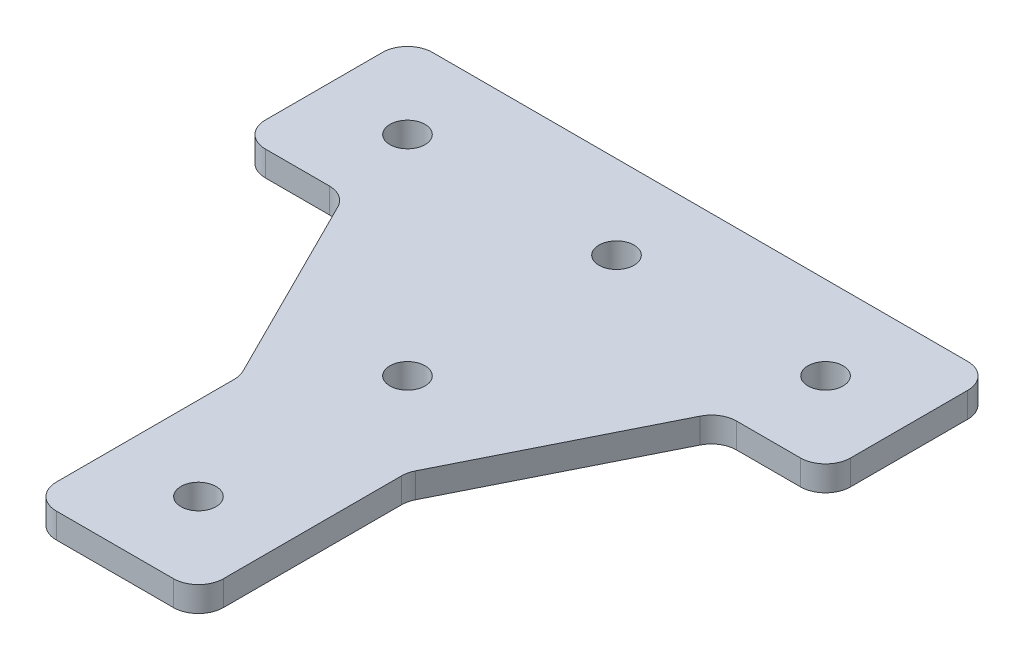
ISO-10303-21;
HEADER;
FILE_DESCRIPTION(('STEP AP214'),'2;1');
FILE_NAME('part.step','',(''),(''),'','','');
FILE_SCHEMA(('AUTOMOTIVE_DESIGN { 1 0 10303 214 1 1 1 1 }'));
ENDSEC;
DATA;
#1=APPLICATION_CONTEXT('core data for automotive mechanical design processes');
#2=APPLICATION_PROTOCOL_DEFINITION('international standard','automotive_design',2000,#1);
#3=PRODUCT_CONTEXT('',#1,'mechanical');
#4=PRODUCT('Part','Part','',(#3));
#5=PRODUCT_RELATED_PRODUCT_CATEGORY('part','',(#4));
#6=PRODUCT_DEFINITION_FORMATION('','',#4);
#7=PRODUCT_DEFINITION_CONTEXT('part definition',#1,'design');
#8=PRODUCT_DEFINITION('design','',#6,#7);
#9=PRODUCT_DEFINITION_SHAPE('','',#8);
#10=(LENGTH_UNIT() NAMED_UNIT(*) SI_UNIT(.MILLI.,.METRE.));
#11=(NAMED_UNIT(*) PLANE_ANGLE_UNIT() SI_UNIT($,.RADIAN.));
#12=(NAMED_UNIT(*) SI_UNIT($,.STERADIAN.) SOLID_ANGLE_UNIT());
#13=UNCERTAINTY_MEASURE_WITH_UNIT(LENGTH_MEASURE(1.E-05),#10,'distance_accuracy_value','');
#14=(GEOMETRIC_REPRESENTATION_CONTEXT(3) GLOBAL_UNCERTAINTY_ASSIGNED_CONTEXT((#13)) GLOBAL_UNIT_ASSIGNED_CONTEXT((#10,
#11,#12)) REPRESENTATION_CONTEXT('',''));
#15=CARTESIAN_POINT('',(0.,0.,0.));
#16=DIRECTION('',(0.,0.,1.));
#17=DIRECTION('',(1.,0.,0.));
#18=AXIS2_PLACEMENT_3D('',#15,#16,#17);
#19=CARTESIAN_POINT('',(22.,3.,11.));
#20=DIRECTION('',(0.894427190999916,0.,0.447213595499958));
#21=DIRECTION('',(0.447213595499958,0.,-0.894427190999916));
#22=AXIS2_PLACEMENT_3D('',#19,#20,#21);
#23=PLANE('',#22);
#24=DIRECTION('',(-0.447213595499958,0.,0.894427190999916));
#25=VECTOR('',#24,1.);
#26=CARTESIAN_POINT('',(22.,3.,11.));
#27=LINE('',#26,#25);
#28=CARTESIAN_POINT('',(21.6708203932499,3.,11.6583592135001));
#29=VERTEX_POINT('',#28);
#30=CARTESIAN_POINT('',(10.3167184270003,3.,34.3665631459995));
#31=VERTEX_POINT('',#30);
#32=EDGE_CURVE('E343',#29,#31,#27,.T.);
#33=ORIENTED_EDGE('',*,*,#32,.T.);
#34=DIRECTION('',(0.,-1.,0.));
#35=VECTOR('',#34,1.);
#36=CARTESIAN_POINT('',(10.3167184270003,3.,34.3665631459995));
#37=LINE('',#36,#35);
#38=CARTESIAN_POINT('',(10.3167184270003,0.,34.3665631459995));
#39=VERTEX_POINT('',#38);
#40=EDGE_CURVE('E197',#31,#39,#37,.T.);
#41=ORIENTED_EDGE('',*,*,#40,.T.);
#42=DIRECTION('',(-0.447213595499958,0.,0.894427190999916));
#43=VECTOR('',#42,1.);
#44=CARTESIAN_POINT('',(22.,0.,11.));
#45=LINE('',#44,#43);
#46=CARTESIAN_POINT('',(21.6708203932499,0.,11.6583592135001));
#47=VERTEX_POINT('',#46);
#48=EDGE_CURVE('E183',#47,#39,#45,.T.);
#49=ORIENTED_EDGE('',*,*,#48,.F.);
#50=DIRECTION('',(0.,-1.,0.));
#51=VECTOR('',#50,1.);
#52=CARTESIAN_POINT('',(21.6708203932499,3.,11.6583592135001));
#53=LINE('',#52,#51);
#54=EDGE_CURVE('E194',#47,#29,#53,.F.);
#55=ORIENTED_EDGE('',*,*,#54,.T.);
#56=EDGE_LOOP('',(#33,#41,#49,#55));
#57=FACE_BOUND('',#56,.T.);
#58=ADVANCED_FACE('F41',(#57),#23,.T.);
#59=CARTESIAN_POINT('',(0.,3.,10.));
#60=DIRECTION('',(0.,0.,-1.));
#61=DIRECTION('',(-1.,0.,0.));
#62=AXIS2_PLACEMENT_3D('',#59,#60,#61);
#63=PLANE('',#62);
#64=DIRECTION('',(1.,0.,0.));
#65=VECTOR('',#64,1.);
#66=CARTESIAN_POINT('',(0.,0.,10.));
#67=LINE('',#66,#65);
#68=CARTESIAN_POINT('',(24.3541019662497,0.,10.));
#69=VERTEX_POINT('',#68);
#70=CARTESIAN_POINT('',(32.,0.,10.));
#71=VERTEX_POINT('',#70);
#72=EDGE_CURVE('E185',#69,#71,#67,.T.);
#73=ORIENTED_EDGE('',*,*,#72,.T.);
#74=DIRECTION('',(0.,-1.,0.));
#75=VECTOR('',#74,1.);
#76=CARTESIAN_POINT('',(32.,3.,10.));
#77=LINE('',#76,#75);
#78=CARTESIAN_POINT('',(32.,3.,10.));
#79=VERTEX_POINT('',#78);
#80=EDGE_CURVE('E276',#71,#79,#77,.F.);
#81=ORIENTED_EDGE('',*,*,#80,.T.);
#82=DIRECTION('',(1.,0.,0.));
#83=VECTOR('',#82,1.);
#84=CARTESIAN_POINT('',(0.,3.,10.));
#85=LINE('',#84,#83);
#86=CARTESIAN_POINT('',(24.3541019662497,3.,10.));
#87=VERTEX_POINT('',#86);
#88=EDGE_CURVE('E346',#87,#79,#85,.T.);
#89=ORIENTED_EDGE('',*,*,#88,.F.);
#90=DIRECTION('',(0.,-1.,0.));
#91=VECTOR('',#90,1.);
#92=CARTESIAN_POINT('',(24.3541019662497,3.,10.));
#93=LINE('',#92,#91);
#94=EDGE_CURVE('E274',#87,#69,#93,.T.);
#95=ORIENTED_EDGE('',*,*,#94,.T.);
#96=EDGE_LOOP('',(#73,#81,#89,#95));
#97=FACE_BOUND('',#96,.T.);
#98=ADVANCED_FACE('F412',(#97),#63,.F.);
#99=CARTESIAN_POINT('',(35.,3.,0.));
#100=DIRECTION('',(-1.,0.,0.));
#101=DIRECTION('',(0.,0.,1.));
#102=AXIS2_PLACEMENT_3D('',#99,#100,#101);
#103=PLANE('',#102);
#104=DIRECTION('',(0.,0.,-1.));
#105=VECTOR('',#104,1.);
#106=CARTESIAN_POINT('',(35.,0.,0.));
#107=LINE('',#106,#105);
#108=CARTESIAN_POINT('',(35.,0.,7.));
#109=VERTEX_POINT('',#108);
#110=CARTESIAN_POINT('',(35.,0.,-7.));
#111=VERTEX_POINT('',#110);
#112=EDGE_CURVE('E379',#109,#111,#107,.T.);
#113=ORIENTED_EDGE('',*,*,#112,.T.);
#114=DIRECTION('',(0.,-1.,0.));
#115=VECTOR('',#114,1.);
#116=CARTESIAN_POINT('',(35.,3.,-7.));
#117=LINE('',#116,#115);
#118=CARTESIAN_POINT('',(35.,3.,-7.));
#119=VERTEX_POINT('',#118);
#120=EDGE_CURVE('E272',#111,#119,#117,.F.);
#121=ORIENTED_EDGE('',*,*,#120,.T.);
#122=DIRECTION('',(0.,0.,-1.));
#123=VECTOR('',#122,1.);
#124=CARTESIAN_POINT('',(35.,3.,0.));
#125=LINE('',#124,#123);
#126=CARTESIAN_POINT('',(35.,3.,7.));
#127=VERTEX_POINT('',#126);
#128=EDGE_CURVE('E349',#127,#119,#125,.T.);
#129=ORIENTED_EDGE('',*,*,#128,.F.);
#130=DIRECTION('',(0.,-1.,0.));
#131=VECTOR('',#130,1.);
#132=CARTESIAN_POINT('',(35.,3.,7.));
#133=LINE('',#132,#131);
#134=EDGE_CURVE('E269',#127,#109,#133,.T.);
#135=ORIENTED_EDGE('',*,*,#134,.T.);
#136=EDGE_LOOP('',(#113,#121,#129,#135));
#137=FACE_BOUND('',#136,.T.);
#138=ADVANCED_FACE('F418',(#137),#103,.F.);
#139=CARTESIAN_POINT('',(0.,3.,-10.));
#140=DIRECTION('',(0.,0.,1.));
#141=DIRECTION('',(1.,0.,0.));
#142=AXIS2_PLACEMENT_3D('',#139,#140,#141);
#143=PLANE('',#142);
#144=DIRECTION('',(-1.,0.,0.));
#145=VECTOR('',#144,1.);
#146=CARTESIAN_POINT('',(0.,3.,-10.));
#147=LINE('',#146,#145);
#148=CARTESIAN_POINT('',(32.,3.,-10.));
#149=VERTEX_POINT('',#148);
#150=CARTESIAN_POINT('',(-32.,3.,-10.));
#151=VERTEX_POINT('',#150);
#152=EDGE_CURVE('E354',#149,#151,#147,.T.);
#153=ORIENTED_EDGE('',*,*,#152,.F.);
#154=DIRECTION('',(0.,-1.,0.));
#155=VECTOR('',#154,1.);
#156=CARTESIAN_POINT('',(32.,3.,-10.));
#157=LINE('',#156,#155);
#158=CARTESIAN_POINT('',(32.,0.,-10.));
#159=VERTEX_POINT('',#158);
#160=EDGE_CURVE('E266',#149,#159,#157,.T.);
#161=ORIENTED_EDGE('',*,*,#160,.T.);
#162=DIRECTION('',(-1.,0.,0.));
#163=VECTOR('',#162,1.);
#164=CARTESIAN_POINT('',(0.,0.,-10.));
#165=LINE('',#164,#163);
#166=CARTESIAN_POINT('',(-32.,0.,-10.));
#167=VERTEX_POINT('',#166);
#168=EDGE_CURVE('E319',#159,#167,#165,.T.);
#169=ORIENTED_EDGE('',*,*,#168,.T.);
#170=DIRECTION('',(0.,-1.,0.));
#171=VECTOR('',#170,1.);
#172=CARTESIAN_POINT('',(-32.,3.,-10.));
#173=LINE('',#172,#171);
#174=EDGE_CURVE('E264',#167,#151,#173,.F.);
#175=ORIENTED_EDGE('',*,*,#174,.T.);
#176=EDGE_LOOP('',(#153,#161,#169,#175));
#177=FACE_BOUND('',#176,.T.);
#178=ADVANCED_FACE('F386',(#177),#143,.F.);
#179=CARTESIAN_POINT('',(-35.,3.,0.));
#180=DIRECTION('',(1.,0.,0.));
#181=DIRECTION('',(0.,0.,-1.));
#182=AXIS2_PLACEMENT_3D('',#179,#180,#181);
#183=PLANE('',#182);
#184=DIRECTION('',(0.,0.,1.));
#185=VECTOR('',#184,1.);
#186=CARTESIAN_POINT('',(-35.,0.,0.));
#187=LINE('',#186,#185);
#188=CARTESIAN_POINT('',(-35.,0.,-7.));
#189=VERTEX_POINT('',#188);
#190=CARTESIAN_POINT('',(-35.,0.,7.));
#191=VERTEX_POINT('',#190);
#192=EDGE_CURVE('E314',#189,#191,#187,.T.);
#193=ORIENTED_EDGE('',*,*,#192,.T.);
#194=DIRECTION('',(0.,-1.,0.));
#195=VECTOR('',#194,1.);
#196=CARTESIAN_POINT('',(-35.,3.,7.));
#197=LINE('',#196,#195);
#198=CARTESIAN_POINT('',(-35.,3.,7.));
#199=VERTEX_POINT('',#198);
#200=EDGE_CURVE('E262',#191,#199,#197,.F.);
#201=ORIENTED_EDGE('',*,*,#200,.T.);
#202=DIRECTION('',(0.,0.,1.));
#203=VECTOR('',#202,1.);
#204=CARTESIAN_POINT('',(-35.,3.,0.));
#205=LINE('',#204,#203);
#206=CARTESIAN_POINT('',(-35.,3.,-7.));
#207=VERTEX_POINT('',#206);
#208=EDGE_CURVE('E357',#207,#199,#205,.T.);
#209=ORIENTED_EDGE('',*,*,#208,.F.);
#210=DIRECTION('',(0.,-1.,0.));
#211=VECTOR('',#210,1.);
#212=CARTESIAN_POINT('',(-35.,3.,-7.));
#213=LINE('',#212,#211);
#214=EDGE_CURVE('E259',#207,#189,#213,.T.);
#215=ORIENTED_EDGE('',*,*,#214,.T.);
#216=EDGE_LOOP('',(#193,#201,#209,#215));
#217=FACE_BOUND('',#216,.T.);
#218=ADVANCED_FACE('F394',(#217),#183,.F.);
#219=CARTESIAN_POINT('',(0.,3.,10.));
#220=DIRECTION('',(0.,0.,-1.));
#221=DIRECTION('',(-1.,0.,0.));
#222=AXIS2_PLACEMENT_3D('',#219,#220,#221);
#223=PLANE('',#222);
#224=DIRECTION('',(1.,0.,0.));
#225=VECTOR('',#224,1.);
#226=CARTESIAN_POINT('',(0.,0.,10.));
#227=LINE('',#226,#225);
#228=CARTESIAN_POINT('',(-32.,0.,10.));
#229=VERTEX_POINT('',#228);
#230=CARTESIAN_POINT('',(-24.3541019662497,0.,10.));
#231=VERTEX_POINT('',#230);
#232=EDGE_CURVE('E309',#229,#231,#227,.T.);
#233=ORIENTED_EDGE('',*,*,#232,.T.);
#234=DIRECTION('',(0.,-1.,0.));
#235=VECTOR('',#234,1.);
#236=CARTESIAN_POINT('',(-24.3541019662497,3.,10.));
#237=LINE('',#236,#235);
#238=CARTESIAN_POINT('',(-24.3541019662497,3.,10.));
#239=VERTEX_POINT('',#238);
#240=EDGE_CURVE('E257',#231,#239,#237,.F.);
#241=ORIENTED_EDGE('',*,*,#240,.T.);
#242=DIRECTION('',(1.,0.,0.));
#243=VECTOR('',#242,1.);
#244=CARTESIAN_POINT('',(0.,3.,10.));
#245=LINE('',#244,#243);
#246=CARTESIAN_POINT('',(-32.,3.,10.));
#247=VERTEX_POINT('',#246);
#248=EDGE_CURVE('E295',#247,#239,#245,.T.);
#249=ORIENTED_EDGE('',*,*,#248,.F.);
#250=DIRECTION('',(0.,-1.,0.));
#251=VECTOR('',#250,1.);
#252=CARTESIAN_POINT('',(-32.,3.,10.));
#253=LINE('',#252,#251);
#254=EDGE_CURVE('E254',#247,#229,#253,.T.);
#255=ORIENTED_EDGE('',*,*,#254,.T.);
#256=EDGE_LOOP('',(#233,#241,#249,#255));
#257=FACE_BOUND('',#256,.T.);
#258=ADVANCED_FACE('F312',(#257),#223,.F.);
#259=CARTESIAN_POINT('',(-22.,3.,11.));
#260=DIRECTION('',(0.894427190999916,0.,-0.447213595499958));
#261=DIRECTION('',(-0.447213595499958,0.,-0.894427190999916));
#262=AXIS2_PLACEMENT_3D('',#259,#260,#261);
#263=PLANE('',#262);
#264=DIRECTION('',(0.447213595499958,0.,0.894427190999916));
#265=VECTOR('',#264,1.);
#266=CARTESIAN_POINT('',(-22.,0.,11.));
#267=LINE('',#266,#265);
#268=CARTESIAN_POINT('',(-21.6708203932499,0.,11.6583592135001));
#269=VERTEX_POINT('',#268);
#270=CARTESIAN_POINT('',(-10.3167184270003,0.,34.3665631459995));
#271=VERTEX_POINT('',#270);
#272=EDGE_CURVE('E310',#269,#271,#267,.T.);
#273=ORIENTED_EDGE('',*,*,#272,.T.);
#274=DIRECTION('',(0.,-1.,0.));
#275=VECTOR('',#274,1.);
#276=CARTESIAN_POINT('',(-10.3167184270003,3.,34.3665631459995));
#277=LINE('',#276,#275);
#278=CARTESIAN_POINT('',(-10.3167184270003,3.,34.3665631459995));
#279=VERTEX_POINT('',#278);
#280=EDGE_CURVE('E252',#271,#279,#277,.F.);
#281=ORIENTED_EDGE('',*,*,#280,.T.);
#282=DIRECTION('',(0.447213595499958,0.,0.894427190999916));
#283=VECTOR('',#282,1.);
#284=CARTESIAN_POINT('',(-22.,3.,11.));
#285=LINE('',#284,#283);
#286=CARTESIAN_POINT('',(-21.6708203932499,3.,11.6583592135001));
#287=VERTEX_POINT('',#286);
#288=EDGE_CURVE('E293',#287,#279,#285,.T.);
#289=ORIENTED_EDGE('',*,*,#288,.F.);
#290=DIRECTION('',(0.,-1.,0.));
#291=VECTOR('',#290,1.);
#292=CARTESIAN_POINT('',(-21.6708203932499,0.,11.6583592135001));
#293=LINE('',#292,#291);
#294=EDGE_CURVE('E249',#287,#269,#293,.T.);
#295=ORIENTED_EDGE('',*,*,#294,.T.);
#296=EDGE_LOOP('',(#273,#281,#289,#295));
#297=FACE_BOUND('',#296,.T.);
#298=ADVANCED_FACE('F301',(#297),#263,.F.);
#299=CARTESIAN_POINT('',(-10.,3.,0.));
#300=DIRECTION('',(1.,0.,0.));
#301=DIRECTION('',(0.,0.,-1.));
#302=AXIS2_PLACEMENT_3D('',#299,#300,#301);
#303=PLANE('',#302);
#304=DIRECTION('',(0.,0.,1.));
#305=VECTOR('',#304,1.);
#306=CARTESIAN_POINT('',(-10.,0.,0.));
#307=LINE('',#306,#305);
#308=CARTESIAN_POINT('',(-10.,0.,35.7082039324994));
#309=VERTEX_POINT('',#308);
#310=CARTESIAN_POINT('',(-9.99999999999999,0.,57.));
#311=VERTEX_POINT('',#310);
#312=EDGE_CURVE('E316',#309,#311,#307,.T.);
#313=ORIENTED_EDGE('',*,*,#312,.T.);
#314=DIRECTION('',(0.,-1.,0.));
#315=VECTOR('',#314,1.);
#316=CARTESIAN_POINT('',(-9.99999999999999,3.,57.));
#317=LINE('',#316,#315);
#318=CARTESIAN_POINT('',(-9.99999999999999,3.,57.));
#319=VERTEX_POINT('',#318);
#320=EDGE_CURVE('E56',#311,#319,#317,.F.);
#321=ORIENTED_EDGE('',*,*,#320,.T.);
#322=DIRECTION('',(0.,0.,1.));
#323=VECTOR('',#322,1.);
#324=CARTESIAN_POINT('',(-10.,3.,0.));
#325=LINE('',#324,#323);
#326=CARTESIAN_POINT('',(-10.,3.,35.7082039324994));
#327=VERTEX_POINT('',#326);
#328=EDGE_CURVE('E304',#327,#319,#325,.T.);
#329=ORIENTED_EDGE('',*,*,#328,.F.);
#330=DIRECTION('',(0.,-1.,0.));
#331=VECTOR('',#330,1.);
#332=CARTESIAN_POINT('',(-10.,0.,35.7082039324994));
#333=LINE('',#332,#331);
#334=EDGE_CURVE('E245',#327,#309,#333,.T.);
#335=ORIENTED_EDGE('',*,*,#334,.T.);
#336=EDGE_LOOP('',(#313,#321,#329,#335));
#337=FACE_BOUND('',#336,.T.);
#338=ADVANCED_FACE('F441',(#337),#303,.F.);
#339=CARTESIAN_POINT('',(0.,3.,60.));
#340=DIRECTION('',(0.,0.,-1.));
#341=DIRECTION('',(-1.,0.,0.));
#342=AXIS2_PLACEMENT_3D('',#339,#340,#341);
#343=PLANE('',#342);
#344=DIRECTION('',(1.,0.,0.));
#345=VECTOR('',#344,1.);
#346=CARTESIAN_POINT('',(0.,0.,60.));
#347=LINE('',#346,#345);
#348=CARTESIAN_POINT('',(-6.99999999999999,0.,60.));
#349=VERTEX_POINT('',#348);
#350=CARTESIAN_POINT('',(7.00000000000001,0.,60.));
#351=VERTEX_POINT('',#350);
#352=EDGE_CURVE('E324',#349,#351,#347,.T.);
#353=ORIENTED_EDGE('',*,*,#352,.T.);
#354=DIRECTION('',(0.,-1.,0.));
#355=VECTOR('',#354,1.);
#356=CARTESIAN_POINT('',(7.00000000000001,3.,60.));
#357=LINE('',#356,#355);
#358=CARTESIAN_POINT('',(7.00000000000001,3.,60.));
#359=VERTEX_POINT('',#358);
#360=EDGE_CURVE('E231',#351,#359,#357,.F.);
#361=ORIENTED_EDGE('',*,*,#360,.T.);
#362=DIRECTION('',(1.,0.,0.));
#363=VECTOR('',#362,1.);
#364=CARTESIAN_POINT('',(0.,3.,60.));
#365=LINE('',#364,#363);
#366=CARTESIAN_POINT('',(-6.99999999999999,3.,60.));
#367=VERTEX_POINT('',#366);
#368=EDGE_CURVE('E362',#367,#359,#365,.T.);
#369=ORIENTED_EDGE('',*,*,#368,.F.);
#370=DIRECTION('',(0.,-1.,0.));
#371=VECTOR('',#370,1.);
#372=CARTESIAN_POINT('',(-6.99999999999999,3.,60.));
#373=LINE('',#372,#371);
#374=EDGE_CURVE('E228',#367,#349,#373,.T.);
#375=ORIENTED_EDGE('',*,*,#374,.T.);
#376=EDGE_LOOP('',(#353,#361,#369,#375));
#377=FACE_BOUND('',#376,.T.);
#378=ADVANCED_FACE('F447',(#377),#343,.F.);
#379=CARTESIAN_POINT('',(25.,3.,0.));
#380=DIRECTION('',(0.,-1.,0.));
#381=DIRECTION('',(0.,0.,-1.));
#382=AXIS2_PLACEMENT_3D('',#379,#380,#381);
#383=CYLINDRICAL_SURFACE('',#382,2.1);
#384=CARTESIAN_POINT('',(25.,3.,0.));
#385=DIRECTION('',(0.,1.,0.));
#386=DIRECTION('',(0.,0.,1.));
#387=AXIS2_PLACEMENT_3D('',#384,#385,#386);
#388=CIRCLE('',#387,2.1);
#389=CARTESIAN_POINT('',(25.,3.,2.1));
#390=VERTEX_POINT('',#389);
#391=EDGE_CURVE('E206',#390,#390,#388,.T.);
#392=ORIENTED_EDGE('',*,*,#391,.T.);
#393=EDGE_LOOP('',(#392));
#394=FACE_BOUND('',#393,.T.);
#395=CARTESIAN_POINT('',(25.,0.,0.));
#396=DIRECTION('',(0.,1.,0.));
#397=DIRECTION('',(0.,0.,1.));
#398=AXIS2_PLACEMENT_3D('',#395,#396,#397);
#399=CIRCLE('',#398,2.1);
#400=CARTESIAN_POINT('',(25.,0.,2.1));
#401=VERTEX_POINT('',#400);
#402=EDGE_CURVE('E338',#401,#401,#399,.T.);
#403=ORIENTED_EDGE('',*,*,#402,.F.);
#404=EDGE_LOOP('',(#403));
#405=FACE_BOUND('',#404,.T.);
#406=ADVANCED_FACE('F482',(#394,#405),#383,.F.);
#407=CARTESIAN_POINT('',(-25.,3.,0.));
#408=DIRECTION('',(0.,-1.,0.));
#409=DIRECTION('',(0.,0.,-1.));
#410=AXIS2_PLACEMENT_3D('',#407,#408,#409);
#411=CYLINDRICAL_SURFACE('',#410,2.1);
#412=CARTESIAN_POINT('',(-25.,3.,0.));
#413=DIRECTION('',(0.,1.,0.));
#414=DIRECTION('',(0.,0.,1.));
#415=AXIS2_PLACEMENT_3D('',#412,#413,#414);
#416=CIRCLE('',#415,2.1);
#417=CARTESIAN_POINT('',(-25.,3.,2.1));
#418=VERTEX_POINT('',#417);
#419=EDGE_CURVE('E373',#418,#418,#416,.T.);
#420=ORIENTED_EDGE('',*,*,#419,.T.);
#421=EDGE_LOOP('',(#420));
#422=FACE_BOUND('',#421,.T.);
#423=CARTESIAN_POINT('',(-25.,0.,0.));
#424=DIRECTION('',(0.,1.,0.));
#425=DIRECTION('',(0.,0.,1.));
#426=AXIS2_PLACEMENT_3D('',#423,#424,#425);
#427=CIRCLE('',#426,2.1);
#428=CARTESIAN_POINT('',(-25.,0.,2.1));
#429=VERTEX_POINT('',#428);
#430=EDGE_CURVE('E336',#429,#429,#427,.T.);
#431=ORIENTED_EDGE('',*,*,#430,.F.);
#432=EDGE_LOOP('',(#431));
#433=FACE_BOUND('',#432,.T.);
#434=ADVANCED_FACE('F493',(#422,#433),#411,.F.);
#435=CARTESIAN_POINT('',(0.,3.,25.));
#436=DIRECTION('',(0.,-1.,0.));
#437=DIRECTION('',(0.,0.,-1.));
#438=AXIS2_PLACEMENT_3D('',#435,#436,#437);
#439=CYLINDRICAL_SURFACE('',#438,2.1);
#440=CARTESIAN_POINT('',(0.,3.,25.));
#441=DIRECTION('',(0.,1.,0.));
#442=DIRECTION('',(0.,0.,1.));
#443=AXIS2_PLACEMENT_3D('',#440,#441,#442);
#444=CIRCLE('',#443,2.1);
#445=CARTESIAN_POINT('',(0.,3.,27.1));
#446=VERTEX_POINT('',#445);
#447=EDGE_CURVE('E370',#446,#446,#444,.T.);
#448=ORIENTED_EDGE('',*,*,#447,.T.);
#449=EDGE_LOOP('',(#448));
#450=FACE_BOUND('',#449,.T.);
#451=CARTESIAN_POINT('',(0.,0.,25.));
#452=DIRECTION('',(0.,1.,0.));
#453=DIRECTION('',(0.,0.,1.));
#454=AXIS2_PLACEMENT_3D('',#451,#452,#453);
#455=CIRCLE('',#454,2.1);
#456=CARTESIAN_POINT('',(0.,0.,27.1));
#457=VERTEX_POINT('',#456);
#458=EDGE_CURVE('E333',#457,#457,#455,.T.);
#459=ORIENTED_EDGE('',*,*,#458,.F.);
#460=EDGE_LOOP('',(#459));
#461=FACE_BOUND('',#460,.T.);
#462=ADVANCED_FACE('F489',(#450,#461),#439,.F.);
#463=CARTESIAN_POINT('',(0.,3.,50.));
#464=DIRECTION('',(0.,-1.,0.));
#465=DIRECTION('',(0.,0.,-1.));
#466=AXIS2_PLACEMENT_3D('',#463,#464,#465);
#467=CYLINDRICAL_SURFACE('',#466,2.1);
#468=CARTESIAN_POINT('',(0.,3.,50.));
#469=DIRECTION('',(0.,1.,0.));
#470=DIRECTION('',(0.,0.,1.));
#471=AXIS2_PLACEMENT_3D('',#468,#469,#470);
#472=CIRCLE('',#471,2.1);
#473=CARTESIAN_POINT('',(0.,3.,52.1));
#474=VERTEX_POINT('',#473);
#475=EDGE_CURVE('E367',#474,#474,#472,.T.);
#476=ORIENTED_EDGE('',*,*,#475,.T.);
#477=EDGE_LOOP('',(#476));
#478=FACE_BOUND('',#477,.T.);
#479=CARTESIAN_POINT('',(0.,0.,50.));
#480=DIRECTION('',(0.,1.,0.));
#481=DIRECTION('',(0.,0.,1.));
#482=AXIS2_PLACEMENT_3D('',#479,#480,#481);
#483=CIRCLE('',#482,2.1);
#484=CARTESIAN_POINT('',(0.,0.,52.1));
#485=VERTEX_POINT('',#484);
#486=EDGE_CURVE('E330',#485,#485,#483,.T.);
#487=ORIENTED_EDGE('',*,*,#486,.F.);
#488=EDGE_LOOP('',(#487));
#489=FACE_BOUND('',#488,.T.);
#490=ADVANCED_FACE('F486',(#478,#489),#467,.F.);
#491=CARTESIAN_POINT('',(10.,3.,0.));
#492=DIRECTION('',(-1.,0.,0.));
#493=DIRECTION('',(0.,0.,1.));
#494=AXIS2_PLACEMENT_3D('',#491,#492,#493);
#495=PLANE('',#494);
#496=DIRECTION('',(0.,0.,-1.));
#497=VECTOR('',#496,1.);
#498=CARTESIAN_POINT('',(10.,0.,0.));
#499=LINE('',#498,#497);
#500=CARTESIAN_POINT('',(10.,0.,57.));
#501=VERTEX_POINT('',#500);
#502=CARTESIAN_POINT('',(10.,0.,35.7082039324994));
#503=VERTEX_POINT('',#502);
#504=EDGE_CURVE('E327',#501,#503,#499,.T.);
#505=ORIENTED_EDGE('',*,*,#504,.T.);
#506=DIRECTION('',(0.,-1.,0.));
#507=VECTOR('',#506,1.);
#508=CARTESIAN_POINT('',(10.,3.,35.7082039324994));
#509=LINE('',#508,#507);
#510=CARTESIAN_POINT('',(10.,3.,35.7082039324994));
#511=VERTEX_POINT('',#510);
#512=EDGE_CURVE('E214',#503,#511,#509,.F.);
#513=ORIENTED_EDGE('',*,*,#512,.T.);
#514=DIRECTION('',(0.,0.,-1.));
#515=VECTOR('',#514,1.);
#516=CARTESIAN_POINT('',(10.,3.,0.));
#517=LINE('',#516,#515);
#518=CARTESIAN_POINT('',(10.,3.,57.));
#519=VERTEX_POINT('',#518);
#520=EDGE_CURVE('E364',#519,#511,#517,.T.);
#521=ORIENTED_EDGE('',*,*,#520,.F.);
#522=DIRECTION('',(0.,-1.,0.));
#523=VECTOR('',#522,1.);
#524=CARTESIAN_POINT('',(10.,3.,57.));
#525=LINE('',#524,#523);
#526=EDGE_CURVE('E203',#519,#501,#525,.T.);
#527=ORIENTED_EDGE('',*,*,#526,.T.);
#528=EDGE_LOOP('',(#505,#513,#521,#527));
#529=FACE_BOUND('',#528,.T.);
#530=ADVANCED_FACE('F453',(#529),#495,.F.);
#531=CARTESIAN_POINT('',(0.,3.,0.));
#532=DIRECTION('',(0.,-1.,0.));
#533=DIRECTION('',(0.,0.,-1.));
#534=AXIS2_PLACEMENT_3D('',#531,#532,#533);
#535=CYLINDRICAL_SURFACE('',#534,2.1);
#536=CARTESIAN_POINT('',(0.,3.,0.));
#537=DIRECTION('',(0.,1.,0.));
#538=DIRECTION('',(0.,0.,1.));
#539=AXIS2_PLACEMENT_3D('',#536,#537,#538);
#540=CIRCLE('',#539,2.1);
#541=CARTESIAN_POINT('',(0.,3.,2.1));
#542=VERTEX_POINT('',#541);
#543=EDGE_CURVE('E201',#542,#542,#540,.T.);
#544=ORIENTED_EDGE('',*,*,#543,.T.);
#545=EDGE_LOOP('',(#544));
#546=FACE_BOUND('',#545,.T.);
#547=CARTESIAN_POINT('',(0.,0.,0.));
#548=DIRECTION('',(0.,1.,0.));
#549=DIRECTION('',(0.,0.,1.));
#550=AXIS2_PLACEMENT_3D('',#547,#548,#549);
#551=CIRCLE('',#550,2.1);
#552=CARTESIAN_POINT('',(0.,0.,2.1));
#553=VERTEX_POINT('',#552);
#554=EDGE_CURVE('E209',#553,#553,#551,.T.);
#555=ORIENTED_EDGE('',*,*,#554,.F.);
#556=EDGE_LOOP('',(#555));
#557=FACE_BOUND('',#556,.T.);
#558=ADVANCED_FACE('F485',(#546,#557),#535,.F.);
#559=CARTESIAN_POINT('',(0.,3.,0.));
#560=DIRECTION('',(0.,1.,0.));
#561=DIRECTION('',(0.,0.,1.));
#562=AXIS2_PLACEMENT_3D('',#559,#560,#561);
#563=PLANE('',#562);
#564=ORIENTED_EDGE('',*,*,#368,.T.);
#565=CARTESIAN_POINT('',(7.00000000000001,3.,57.));
#566=DIRECTION('',(0.,1.,0.));
#567=DIRECTION('',(0.,0.,1.));
#568=AXIS2_PLACEMENT_3D('',#565,#566,#567);
#569=CIRCLE('',#568,3.);
#570=EDGE_CURVE('E243',#359,#519,#569,.T.);
#571=ORIENTED_EDGE('',*,*,#570,.T.);
#572=ORIENTED_EDGE('',*,*,#520,.T.);
#573=CARTESIAN_POINT('',(13.,3.,35.7082039324994));
#574=DIRECTION('',(0.,1.,0.));
#575=DIRECTION('',(0.,0.,1.));
#576=AXIS2_PLACEMENT_3D('',#573,#574,#575);
#577=CIRCLE('',#576,3.);
#578=EDGE_CURVE('E280',#511,#31,#577,.F.);
#579=ORIENTED_EDGE('',*,*,#578,.T.);
#580=ORIENTED_EDGE('',*,*,#32,.F.);
#581=CARTESIAN_POINT('',(24.3541019662497,3.,13.));
#582=DIRECTION('',(0.,1.,0.));
#583=DIRECTION('',(0.,0.,1.));
#584=AXIS2_PLACEMENT_3D('',#581,#582,#583);
#585=CIRCLE('',#584,3.);
#586=EDGE_CURVE('E11',#29,#87,#585,.F.);
#587=ORIENTED_EDGE('',*,*,#586,.T.);
#588=ORIENTED_EDGE('',*,*,#88,.T.);
#589=CARTESIAN_POINT('',(32.,3.,7.));
#590=DIRECTION('',(0.,1.,0.));
#591=DIRECTION('',(0.,0.,1.));
#592=AXIS2_PLACEMENT_3D('',#589,#590,#591);
#593=CIRCLE('',#592,3.);
#594=EDGE_CURVE('E235',#79,#127,#593,.T.);
#595=ORIENTED_EDGE('',*,*,#594,.T.);
#596=ORIENTED_EDGE('',*,*,#128,.T.);
#597=CARTESIAN_POINT('',(32.,3.,-7.));
#598=DIRECTION('',(0.,1.,0.));
#599=DIRECTION('',(0.,0.,1.));
#600=AXIS2_PLACEMENT_3D('',#597,#598,#599);
#601=CIRCLE('',#600,3.);
#602=EDGE_CURVE('E237',#119,#149,#601,.T.);
#603=ORIENTED_EDGE('',*,*,#602,.T.);
#604=ORIENTED_EDGE('',*,*,#152,.T.);
#605=CARTESIAN_POINT('',(-32.,3.,-7.));
#606=DIRECTION('',(0.,1.,0.));
#607=DIRECTION('',(0.,0.,1.));
#608=AXIS2_PLACEMENT_3D('',#605,#606,#607);
#609=CIRCLE('',#608,3.);
#610=EDGE_CURVE('E233',#151,#207,#609,.T.);
#611=ORIENTED_EDGE('',*,*,#610,.T.);
#612=ORIENTED_EDGE('',*,*,#208,.T.);
#613=CARTESIAN_POINT('',(-32.,3.,7.));
#614=DIRECTION('',(0.,1.,0.));
#615=DIRECTION('',(0.,0.,1.));
#616=AXIS2_PLACEMENT_3D('',#613,#614,#615);
#617=CIRCLE('',#616,3.);
#618=EDGE_CURVE('E239',#199,#247,#617,.T.);
#619=ORIENTED_EDGE('',*,*,#618,.T.);
#620=ORIENTED_EDGE('',*,*,#248,.T.);
#621=CARTESIAN_POINT('',(-24.3541019662497,3.,13.));
#622=DIRECTION('',(0.,1.,0.));
#623=DIRECTION('',(0.,0.,1.));
#624=AXIS2_PLACEMENT_3D('',#621,#622,#623);
#625=CIRCLE('',#624,3.);
#626=EDGE_CURVE('E190',#239,#287,#625,.F.);
#627=ORIENTED_EDGE('',*,*,#626,.T.);
#628=ORIENTED_EDGE('',*,*,#288,.T.);
#629=CARTESIAN_POINT('',(-13.,3.,35.7082039324994));
#630=DIRECTION('',(0.,1.,0.));
#631=DIRECTION('',(0.,0.,1.));
#632=AXIS2_PLACEMENT_3D('',#629,#630,#631);
#633=CIRCLE('',#632,3.);
#634=EDGE_CURVE('E63',#279,#327,#633,.F.);
#635=ORIENTED_EDGE('',*,*,#634,.T.);
#636=ORIENTED_EDGE('',*,*,#328,.T.);
#637=CARTESIAN_POINT('',(-6.99999999999999,3.,57.));
#638=DIRECTION('',(0.,1.,0.));
#639=DIRECTION('',(0.,0.,1.));
#640=AXIS2_PLACEMENT_3D('',#637,#638,#639);
#641=CIRCLE('',#640,3.);
#642=EDGE_CURVE('E241',#319,#367,#641,.T.);
#643=ORIENTED_EDGE('',*,*,#642,.T.);
#644=EDGE_LOOP('',(#564,#571,#572,#579,#580,#587,#588,#595,#596,#603,#604,#611,#612,#619,#620,
#627,#628,#635,#636,#643));
#645=FACE_BOUND('',#644,.T.);
#646=ORIENTED_EDGE('',*,*,#475,.F.);
#647=EDGE_LOOP('',(#646));
#648=FACE_BOUND('',#647,.T.);
#649=ORIENTED_EDGE('',*,*,#447,.F.);
#650=EDGE_LOOP('',(#649));
#651=FACE_BOUND('',#650,.T.);
#652=ORIENTED_EDGE('',*,*,#419,.F.);
#653=EDGE_LOOP('',(#652));
#654=FACE_BOUND('',#653,.T.);
#655=ORIENTED_EDGE('',*,*,#391,.F.);
#656=EDGE_LOOP('',(#655));
#657=FACE_BOUND('',#656,.T.);
#658=ORIENTED_EDGE('',*,*,#543,.F.);
#659=EDGE_LOOP('',(#658));
#660=FACE_BOUND('',#659,.T.);
#661=ADVANCED_FACE('F291',(#645,#648,#651,#654,#657,#660),#563,.T.);
#662=CARTESIAN_POINT('',(0.,0.,0.));
#663=DIRECTION('',(0.,1.,0.));
#664=DIRECTION('',(0.,0.,1.));
#665=AXIS2_PLACEMENT_3D('',#662,#663,#664);
#666=PLANE('',#665);
#667=ORIENTED_EDGE('',*,*,#504,.F.);
#668=CARTESIAN_POINT('',(7.00000000000001,0.,57.));
#669=DIRECTION('',(0.,1.,0.));
#670=DIRECTION('',(0.,0.,1.));
#671=AXIS2_PLACEMENT_3D('',#668,#669,#670);
#672=CIRCLE('',#671,3.);
#673=EDGE_CURVE('E226',#501,#351,#672,.F.);
#674=ORIENTED_EDGE('',*,*,#673,.T.);
#675=ORIENTED_EDGE('',*,*,#352,.F.);
#676=CARTESIAN_POINT('',(-6.99999999999999,0.,57.));
#677=DIRECTION('',(0.,1.,0.));
#678=DIRECTION('',(0.,0.,1.));
#679=AXIS2_PLACEMENT_3D('',#676,#677,#678);
#680=CIRCLE('',#679,3.);
#681=EDGE_CURVE('E224',#349,#311,#680,.F.);
#682=ORIENTED_EDGE('',*,*,#681,.T.);
#683=ORIENTED_EDGE('',*,*,#312,.F.);
#684=CARTESIAN_POINT('',(-13.,0.,35.7082039324994));
#685=DIRECTION('',(0.,1.,0.));
#686=DIRECTION('',(0.,0.,1.));
#687=AXIS2_PLACEMENT_3D('',#684,#685,#686);
#688=CIRCLE('',#687,3.);
#689=EDGE_CURVE('E282',#309,#271,#688,.T.);
#690=ORIENTED_EDGE('',*,*,#689,.T.);
#691=ORIENTED_EDGE('',*,*,#272,.F.);
#692=CARTESIAN_POINT('',(-24.3541019662497,0.,13.));
#693=DIRECTION('',(0.,1.,0.));
#694=DIRECTION('',(0.,0.,1.));
#695=AXIS2_PLACEMENT_3D('',#692,#693,#694);
#696=CIRCLE('',#695,3.);
#697=EDGE_CURVE('E285',#269,#231,#696,.T.);
#698=ORIENTED_EDGE('',*,*,#697,.T.);
#699=ORIENTED_EDGE('',*,*,#232,.F.);
#700=CARTESIAN_POINT('',(-32.,0.,7.));
#701=DIRECTION('',(0.,1.,0.));
#702=DIRECTION('',(0.,0.,1.));
#703=AXIS2_PLACEMENT_3D('',#700,#701,#702);
#704=CIRCLE('',#703,3.);
#705=EDGE_CURVE('E222',#229,#191,#704,.F.);
#706=ORIENTED_EDGE('',*,*,#705,.T.);
#707=ORIENTED_EDGE('',*,*,#192,.F.);
#708=CARTESIAN_POINT('',(-32.,0.,-7.));
#709=DIRECTION('',(0.,1.,0.));
#710=DIRECTION('',(0.,0.,1.));
#711=AXIS2_PLACEMENT_3D('',#708,#709,#710);
#712=CIRCLE('',#711,3.);
#713=EDGE_CURVE('E216',#189,#167,#712,.F.);
#714=ORIENTED_EDGE('',*,*,#713,.T.);
#715=ORIENTED_EDGE('',*,*,#168,.F.);
#716=CARTESIAN_POINT('',(32.,0.,-7.));
#717=DIRECTION('',(0.,1.,0.));
#718=DIRECTION('',(0.,0.,1.));
#719=AXIS2_PLACEMENT_3D('',#716,#717,#718);
#720=CIRCLE('',#719,3.);
#721=EDGE_CURVE('E220',#159,#111,#720,.F.);
#722=ORIENTED_EDGE('',*,*,#721,.T.);
#723=ORIENTED_EDGE('',*,*,#112,.F.);
#724=CARTESIAN_POINT('',(32.,0.,7.));
#725=DIRECTION('',(0.,1.,0.));
#726=DIRECTION('',(0.,0.,1.));
#727=AXIS2_PLACEMENT_3D('',#724,#725,#726);
#728=CIRCLE('',#727,3.);
#729=EDGE_CURVE('E218',#109,#71,#728,.F.);
#730=ORIENTED_EDGE('',*,*,#729,.T.);
#731=ORIENTED_EDGE('',*,*,#72,.F.);
#732=CARTESIAN_POINT('',(24.3541019662497,0.,13.));
#733=DIRECTION('',(0.,1.,0.));
#734=DIRECTION('',(0.,0.,1.));
#735=AXIS2_PLACEMENT_3D('',#732,#733,#734);
#736=CIRCLE('',#735,3.);
#737=EDGE_CURVE('E49',#69,#47,#736,.T.);
#738=ORIENTED_EDGE('',*,*,#737,.T.);
#739=ORIENTED_EDGE('',*,*,#48,.T.);
#740=CARTESIAN_POINT('',(13.,0.,35.7082039324994));
#741=DIRECTION('',(0.,1.,0.));
#742=DIRECTION('',(0.,0.,1.));
#743=AXIS2_PLACEMENT_3D('',#740,#741,#742);
#744=CIRCLE('',#743,3.);
#745=EDGE_CURVE('E278',#39,#503,#744,.T.);
#746=ORIENTED_EDGE('',*,*,#745,.T.);
#747=EDGE_LOOP('',(#667,#674,#675,#682,#683,#690,#691,#698,#699,#706,#707,#714,#715,#722,#723,
#730,#731,#738,#739,#746));
#748=FACE_BOUND('',#747,.T.);
#749=ORIENTED_EDGE('',*,*,#486,.T.);
#750=EDGE_LOOP('',(#749));
#751=FACE_BOUND('',#750,.T.);
#752=ORIENTED_EDGE('',*,*,#458,.T.);
#753=EDGE_LOOP('',(#752));
#754=FACE_BOUND('',#753,.T.);
#755=ORIENTED_EDGE('',*,*,#430,.T.);
#756=EDGE_LOOP('',(#755));
#757=FACE_BOUND('',#756,.T.);
#758=ORIENTED_EDGE('',*,*,#402,.T.);
#759=EDGE_LOOP('',(#758));
#760=FACE_BOUND('',#759,.T.);
#761=ORIENTED_EDGE('',*,*,#554,.T.);
#762=EDGE_LOOP('',(#761));
#763=FACE_BOUND('',#762,.T.);
#764=ADVANCED_FACE('F181',(#748,#751,#754,#757,#760,#763),#666,.F.);
#765=CARTESIAN_POINT('',(13.,3.,35.7082039324994));
#766=DIRECTION('',(0.,-1.,0.));
#767=DIRECTION('',(0.,0.,-1.));
#768=AXIS2_PLACEMENT_3D('',#765,#766,#767);
#769=CYLINDRICAL_SURFACE('',#768,3.);
#770=ORIENTED_EDGE('',*,*,#578,.F.);
#771=ORIENTED_EDGE('',*,*,#512,.F.);
#772=ORIENTED_EDGE('',*,*,#745,.F.);
#773=ORIENTED_EDGE('',*,*,#40,.F.);
#774=EDGE_LOOP('',(#770,#771,#772,#773));
#775=FACE_BOUND('',#774,.T.);
#776=ADVANCED_FACE('F423',(#775),#769,.F.);
#777=CARTESIAN_POINT('',(7.00000000000001,3.,57.));
#778=DIRECTION('',(0.,-1.,0.));
#779=DIRECTION('',(0.,0.,-1.));
#780=AXIS2_PLACEMENT_3D('',#777,#778,#779);
#781=CYLINDRICAL_SURFACE('',#780,3.);
#782=ORIENTED_EDGE('',*,*,#570,.F.);
#783=ORIENTED_EDGE('',*,*,#360,.F.);
#784=ORIENTED_EDGE('',*,*,#673,.F.);
#785=ORIENTED_EDGE('',*,*,#526,.F.);
#786=EDGE_LOOP('',(#782,#783,#784,#785));
#787=FACE_BOUND('',#786,.T.);
#788=ADVANCED_FACE('F426',(#787),#781,.T.);
#789=CARTESIAN_POINT('',(-6.99999999999999,3.,57.));
#790=DIRECTION('',(0.,-1.,0.));
#791=DIRECTION('',(0.,0.,-1.));
#792=AXIS2_PLACEMENT_3D('',#789,#790,#791);
#793=CYLINDRICAL_SURFACE('',#792,3.);
#794=ORIENTED_EDGE('',*,*,#642,.F.);
#795=ORIENTED_EDGE('',*,*,#320,.F.);
#796=ORIENTED_EDGE('',*,*,#681,.F.);
#797=ORIENTED_EDGE('',*,*,#374,.F.);
#798=EDGE_LOOP('',(#794,#795,#796,#797));
#799=FACE_BOUND('',#798,.T.);
#800=ADVANCED_FACE('F430',(#799),#793,.T.);
#801=CARTESIAN_POINT('',(-13.,3.,35.7082039324994));
#802=DIRECTION('',(0.,1.,0.));
#803=DIRECTION('',(0.,0.,1.));
#804=AXIS2_PLACEMENT_3D('',#801,#802,#803);
#805=CYLINDRICAL_SURFACE('',#804,3.);
#806=ORIENTED_EDGE('',*,*,#634,.F.);
#807=ORIENTED_EDGE('',*,*,#280,.F.);
#808=ORIENTED_EDGE('',*,*,#689,.F.);
#809=ORIENTED_EDGE('',*,*,#334,.F.);
#810=EDGE_LOOP('',(#806,#807,#808,#809));
#811=FACE_BOUND('',#810,.T.);
#812=ADVANCED_FACE('F409',(#811),#805,.F.);
#813=CARTESIAN_POINT('',(-24.3541019662497,3.,13.));
#814=DIRECTION('',(0.,1.,0.));
#815=DIRECTION('',(0.,0.,1.));
#816=AXIS2_PLACEMENT_3D('',#813,#814,#815);
#817=CYLINDRICAL_SURFACE('',#816,3.);
#818=ORIENTED_EDGE('',*,*,#626,.F.);
#819=ORIENTED_EDGE('',*,*,#240,.F.);
#820=ORIENTED_EDGE('',*,*,#697,.F.);
#821=ORIENTED_EDGE('',*,*,#294,.F.);
#822=EDGE_LOOP('',(#818,#819,#820,#821));
#823=FACE_BOUND('',#822,.T.);
#824=ADVANCED_FACE('F306',(#823),#817,.F.);
#825=CARTESIAN_POINT('',(-32.,3.,7.));
#826=DIRECTION('',(0.,-1.,0.));
#827=DIRECTION('',(0.,0.,-1.));
#828=AXIS2_PLACEMENT_3D('',#825,#826,#827);
#829=CYLINDRICAL_SURFACE('',#828,3.);
#830=ORIENTED_EDGE('',*,*,#618,.F.);
#831=ORIENTED_EDGE('',*,*,#200,.F.);
#832=ORIENTED_EDGE('',*,*,#705,.F.);
#833=ORIENTED_EDGE('',*,*,#254,.F.);
#834=EDGE_LOOP('',(#830,#831,#832,#833));
#835=FACE_BOUND('',#834,.T.);
#836=ADVANCED_FACE('F398',(#835),#829,.T.);
#837=CARTESIAN_POINT('',(32.,3.,-7.));
#838=DIRECTION('',(0.,-1.,0.));
#839=DIRECTION('',(0.,0.,-1.));
#840=AXIS2_PLACEMENT_3D('',#837,#838,#839);
#841=CYLINDRICAL_SURFACE('',#840,3.);
#842=ORIENTED_EDGE('',*,*,#602,.F.);
#843=ORIENTED_EDGE('',*,*,#120,.F.);
#844=ORIENTED_EDGE('',*,*,#721,.F.);
#845=ORIENTED_EDGE('',*,*,#160,.F.);
#846=EDGE_LOOP('',(#842,#843,#844,#845));
#847=FACE_BOUND('',#846,.T.);
#848=ADVANCED_FACE('F400',(#847),#841,.T.);
#849=CARTESIAN_POINT('',(32.,3.,7.));
#850=DIRECTION('',(0.,-1.,0.));
#851=DIRECTION('',(0.,0.,-1.));
#852=AXIS2_PLACEMENT_3D('',#849,#850,#851);
#853=CYLINDRICAL_SURFACE('',#852,3.);
#854=ORIENTED_EDGE('',*,*,#594,.F.);
#855=ORIENTED_EDGE('',*,*,#80,.F.);
#856=ORIENTED_EDGE('',*,*,#729,.F.);
#857=ORIENTED_EDGE('',*,*,#134,.F.);
#858=EDGE_LOOP('',(#854,#855,#856,#857));
#859=FACE_BOUND('',#858,.T.);
#860=ADVANCED_FACE('F406',(#859),#853,.T.);
#861=CARTESIAN_POINT('',(24.3541019662497,3.,13.));
#862=DIRECTION('',(0.,-1.,0.));
#863=DIRECTION('',(0.,0.,-1.));
#864=AXIS2_PLACEMENT_3D('',#861,#862,#863);
#865=CYLINDRICAL_SURFACE('',#864,3.);
#866=ORIENTED_EDGE('',*,*,#586,.F.);
#867=ORIENTED_EDGE('',*,*,#54,.F.);
#868=ORIENTED_EDGE('',*,*,#737,.F.);
#869=ORIENTED_EDGE('',*,*,#94,.F.);
#870=EDGE_LOOP('',(#866,#867,#868,#869));
#871=FACE_BOUND('',#870,.T.);
#872=ADVANCED_FACE('F200',(#871),#865,.F.);
#873=CARTESIAN_POINT('',(-32.,3.,-7.));
#874=DIRECTION('',(0.,-1.,0.));
#875=DIRECTION('',(0.,0.,-1.));
#876=AXIS2_PLACEMENT_3D('',#873,#874,#875);
#877=CYLINDRICAL_SURFACE('',#876,3.);
#878=ORIENTED_EDGE('',*,*,#610,.F.);
#879=ORIENTED_EDGE('',*,*,#174,.F.);
#880=ORIENTED_EDGE('',*,*,#713,.F.);
#881=ORIENTED_EDGE('',*,*,#214,.F.);
#882=EDGE_LOOP('',(#878,#879,#880,#881));
#883=FACE_BOUND('',#882,.T.);
#884=ADVANCED_FACE('F43',(#883),#877,.T.);
#885=CLOSED_SHELL('',(#58,#98,#138,#178,#218,#258,#298,#338,#378,#406,#434,#462,#490,#530,#558,
#661,#764,#776,#788,#800,#812,#824,#836,#848,#860,#872,#884));
#886=MANIFOLD_SOLID_BREP('B2',#885);
#887=ADVANCED_BREP_SHAPE_REPRESENTATION('',(#18,#886),#14);
#888=SHAPE_DEFINITION_REPRESENTATION(#9,#887);
ENDSEC;
END-ISO-10303-21;
